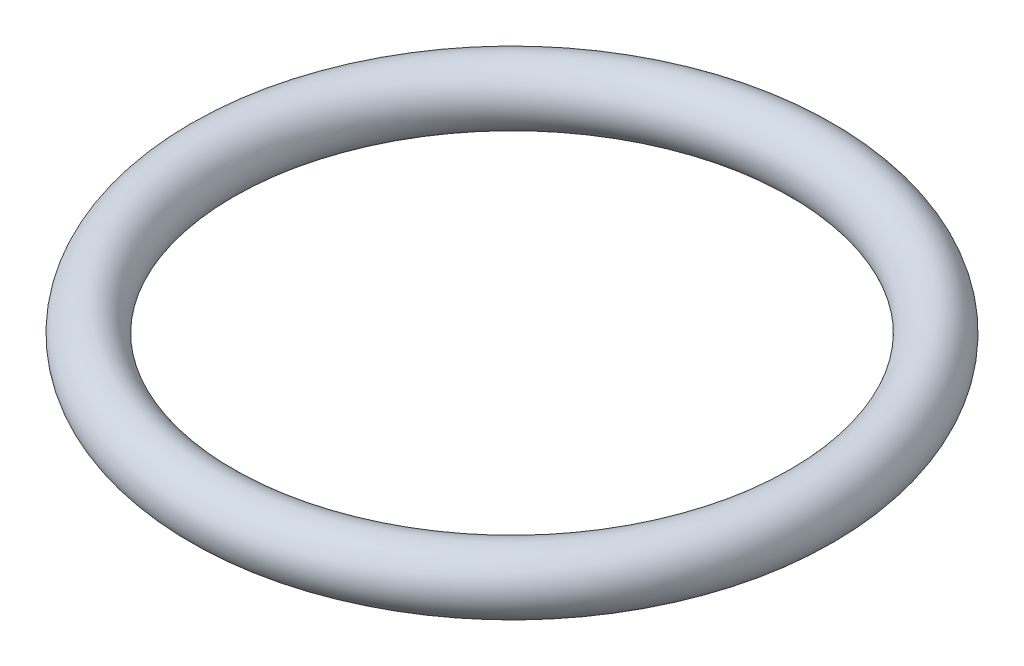
ISO-10303-21;
HEADER;
FILE_DESCRIPTION(('STEP AP214'),'2;1');
FILE_NAME('part.step','',(''),(''),'','','');
FILE_SCHEMA(('AUTOMOTIVE_DESIGN { 1 0 10303 214 1 1 1 1 }'));
ENDSEC;
DATA;
#1=APPLICATION_CONTEXT('core data for automotive mechanical design processes');
#2=APPLICATION_PROTOCOL_DEFINITION('international standard','automotive_design',2000,#1);
#3=PRODUCT_CONTEXT('',#1,'mechanical');
#4=PRODUCT('Part','Part','',(#3));
#5=PRODUCT_RELATED_PRODUCT_CATEGORY('part','',(#4));
#6=PRODUCT_DEFINITION_FORMATION('','',#4);
#7=PRODUCT_DEFINITION_CONTEXT('part definition',#1,'design');
#8=PRODUCT_DEFINITION('design','',#6,#7);
#9=PRODUCT_DEFINITION_SHAPE('','',#8);
#10=(LENGTH_UNIT() NAMED_UNIT(*) SI_UNIT(.MILLI.,.METRE.));
#11=(NAMED_UNIT(*) PLANE_ANGLE_UNIT() SI_UNIT($,.RADIAN.));
#12=(NAMED_UNIT(*) SI_UNIT($,.STERADIAN.) SOLID_ANGLE_UNIT());
#13=UNCERTAINTY_MEASURE_WITH_UNIT(LENGTH_MEASURE(1.E-05),#10,'distance_accuracy_value','');
#14=(GEOMETRIC_REPRESENTATION_CONTEXT(3) GLOBAL_UNCERTAINTY_ASSIGNED_CONTEXT((#13)) GLOBAL_UNIT_ASSIGNED_CONTEXT((#10,
#11,#12)) REPRESENTATION_CONTEXT('',''));
#15=CARTESIAN_POINT('',(0.,0.,0.));
#16=DIRECTION('',(0.,0.,1.));
#17=DIRECTION('',(1.,0.,0.));
#18=AXIS2_PLACEMENT_3D('',#15,#16,#17);
#19=CARTESIAN_POINT('',(0.,0.,0.));
#20=DIRECTION('',(0.,1.,0.));
#21=DIRECTION('',(0.,0.,1.));
#22=AXIS2_PLACEMENT_3D('',#19,#20,#21);
#23=TOROIDAL_SURFACE('',#22,25.,2.5);
#24=CARTESIAN_POINT('',(-25.,0.,0.));
#25=DIRECTION('',(0.,0.,1.));
#26=DIRECTION('',(1.,0.,0.));
#27=AXIS2_PLACEMENT_3D('',#24,#25,#26);
#28=CIRCLE('',#27,2.5);
#29=CARTESIAN_POINT('',(-27.5,0.,0.));
#30=VERTEX_POINT('',#29);
#31=EDGE_CURVE('E10',#30,#30,#28,.T.);
#32=CARTESIAN_POINT('',(0.,0.,0.));
#33=DIRECTION('',(0.,1.,0.));
#34=DIRECTION('',(0.,0.,1.));
#35=AXIS2_PLACEMENT_3D('',#32,#33,#34);
#36=CIRCLE('',#35,27.5);
#37=EDGE_CURVE('',#30,#30,#36,.T.);
#38=ORIENTED_EDGE('',*,*,#31,.T.);
#39=ORIENTED_EDGE('',*,*,#31,.F.);
#40=ORIENTED_EDGE('',*,*,#37,.T.);
#41=ORIENTED_EDGE('',*,*,#37,.F.);
#42=EDGE_LOOP('',(#38,#40,#39,#41));
#43=FACE_BOUND('',#42,.T.);
#44=ADVANCED_FACE('F32',(#43),#23,.T.);
#45=CLOSED_SHELL('',(#44));
#46=MANIFOLD_SOLID_BREP('B2',#45);
#47=ADVANCED_BREP_SHAPE_REPRESENTATION('',(#18,#46),#14);
#48=SHAPE_DEFINITION_REPRESENTATION(#9,#47);
ENDSEC;
END-ISO-10303-21;
